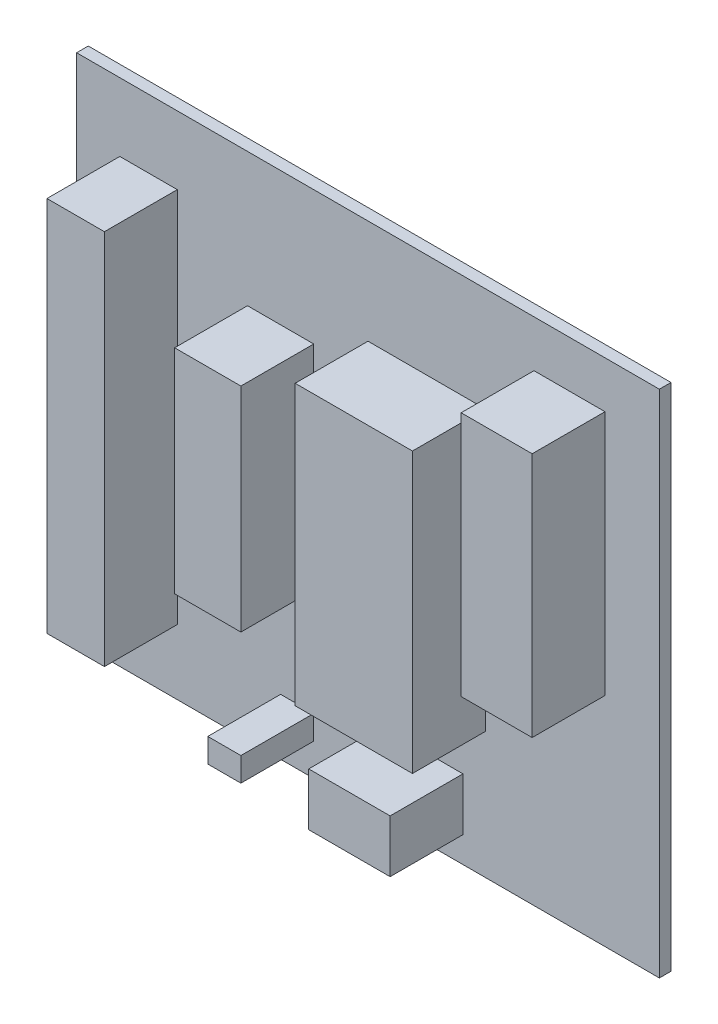
ISO-10303-21;
HEADER;
FILE_DESCRIPTION(('STEP AP214'),'2;1');
FILE_NAME('part.step','',(''),(''),'','','');
FILE_SCHEMA(('AUTOMOTIVE_DESIGN { 1 0 10303 214 1 1 1 1 }'));
ENDSEC;
DATA;
#1=APPLICATION_CONTEXT('core data for automotive mechanical design processes');
#2=APPLICATION_PROTOCOL_DEFINITION('international standard','automotive_design',2000,#1);
#3=PRODUCT_CONTEXT('',#1,'mechanical');
#4=PRODUCT('Part','Part','',(#3));
#5=PRODUCT_RELATED_PRODUCT_CATEGORY('part','',(#4));
#6=PRODUCT_DEFINITION_FORMATION('','',#4);
#7=PRODUCT_DEFINITION_CONTEXT('part definition',#1,'design');
#8=PRODUCT_DEFINITION('design','',#6,#7);
#9=PRODUCT_DEFINITION_SHAPE('','',#8);
#10=(LENGTH_UNIT() NAMED_UNIT(*) SI_UNIT(.MILLI.,.METRE.));
#11=(NAMED_UNIT(*) PLANE_ANGLE_UNIT() SI_UNIT($,.RADIAN.));
#12=(NAMED_UNIT(*) SI_UNIT($,.STERADIAN.) SOLID_ANGLE_UNIT());
#13=UNCERTAINTY_MEASURE_WITH_UNIT(LENGTH_MEASURE(1.E-05),#10,'distance_accuracy_value','');
#14=(GEOMETRIC_REPRESENTATION_CONTEXT(3) GLOBAL_UNCERTAINTY_ASSIGNED_CONTEXT((#13)) GLOBAL_UNIT_ASSIGNED_CONTEXT((#10,
#11,#12)) REPRESENTATION_CONTEXT('',''));
#15=CARTESIAN_POINT('',(0.,0.,0.));
#16=DIRECTION('',(0.,0.,1.));
#17=DIRECTION('',(1.,0.,0.));
#18=AXIS2_PLACEMENT_3D('',#15,#16,#17);
#19=CARTESIAN_POINT('',(0.,0.,0.8));
#20=DIRECTION('',(0.,0.,1.));
#21=DIRECTION('',(1.,0.,0.));
#22=AXIS2_PLACEMENT_3D('',#19,#20,#21);
#23=PLANE('',#22);
#24=DIRECTION('',(0.,-1.,0.));
#25=VECTOR('',#24,1.);
#26=CARTESIAN_POINT('',(-40.,35.,0.8));
#27=LINE('',#26,#25);
#28=CARTESIAN_POINT('',(-40.,35.,0.8));
#29=VERTEX_POINT('',#28);
#30=CARTESIAN_POINT('',(-40.,-35.,0.8));
#31=VERTEX_POINT('',#30);
#32=EDGE_CURVE('E392',#29,#31,#27,.T.);
#33=ORIENTED_EDGE('',*,*,#32,.T.);
#34=DIRECTION('',(1.,0.,0.));
#35=VECTOR('',#34,1.);
#36=CARTESIAN_POINT('',(-40.,-35.,0.8));
#37=LINE('',#36,#35);
#38=CARTESIAN_POINT('',(40.,-35.,0.8));
#39=VERTEX_POINT('',#38);
#40=EDGE_CURVE('E395',#31,#39,#37,.T.);
#41=ORIENTED_EDGE('',*,*,#40,.T.);
#42=DIRECTION('',(0.,1.,0.));
#43=VECTOR('',#42,1.);
#44=CARTESIAN_POINT('',(40.,35.,0.8));
#45=LINE('',#44,#43);
#46=CARTESIAN_POINT('',(40.,35.,0.8));
#47=VERTEX_POINT('',#46);
#48=EDGE_CURVE('E398',#39,#47,#45,.T.);
#49=ORIENTED_EDGE('',*,*,#48,.T.);
#50=DIRECTION('',(-1.,0.,0.));
#51=VECTOR('',#50,1.);
#52=CARTESIAN_POINT('',(-40.,35.,0.8));
#53=LINE('',#52,#51);
#54=EDGE_CURVE('E400',#47,#29,#53,.T.);
#55=ORIENTED_EDGE('',*,*,#54,.T.);
#56=EDGE_LOOP('',(#33,#41,#49,#55));
#57=FACE_BOUND('',#56,.T.);
#58=DIRECTION('',(1.,0.,0.));
#59=VECTOR('',#58,1.);
#60=CARTESIAN_POINT('',(-16.5417209365007,-12.5979993887254,0.8));
#61=LINE('',#60,#59);
#62=CARTESIAN_POINT('',(-16.5417209365007,-12.5979993887254,0.8));
#63=VERTEX_POINT('',#62);
#64=CARTESIAN_POINT('',(-7.44925181246366,-12.5979993887254,0.8));
#65=VERTEX_POINT('',#64);
#66=EDGE_CURVE('E376',#63,#65,#61,.T.);
#67=ORIENTED_EDGE('',*,*,#66,.F.);
#68=DIRECTION('',(0.,-1.,0.));
#69=VECTOR('',#68,1.);
#70=CARTESIAN_POINT('',(-16.5417209365007,-12.5979993887254,0.8));
#71=LINE('',#70,#69);
#72=CARTESIAN_POINT('',(-16.5417209365007,16.6512687572722,0.8));
#73=VERTEX_POINT('',#72);
#74=EDGE_CURVE('E362',#73,#63,#71,.T.);
#75=ORIENTED_EDGE('',*,*,#74,.F.);
#76=DIRECTION('',(-1.,0.,0.));
#77=VECTOR('',#76,1.);
#78=CARTESIAN_POINT('',(-16.5417209365007,16.6512687572722,0.8));
#79=LINE('',#78,#77);
#80=CARTESIAN_POINT('',(-7.44925181246366,16.6512687572722,0.8));
#81=VERTEX_POINT('',#80);
#82=EDGE_CURVE('E367',#81,#73,#79,.T.);
#83=ORIENTED_EDGE('',*,*,#82,.F.);
#84=DIRECTION('',(0.,1.,0.));
#85=VECTOR('',#84,1.);
#86=CARTESIAN_POINT('',(-7.44925181246366,-12.5979993887254,0.8));
#87=LINE('',#86,#85);
#88=EDGE_CURVE('E378',#65,#81,#87,.T.);
#89=ORIENTED_EDGE('',*,*,#88,.F.);
#90=EDGE_LOOP('',(#67,#75,#83,#89));
#91=FACE_BOUND('',#90,.T.);
#92=DIRECTION('',(1.,0.,0.));
#93=VECTOR('',#92,1.);
#94=CARTESIAN_POINT('',(0.,-17.6371991442158,0.8));
#95=LINE('',#94,#93);
#96=CARTESIAN_POINT('',(0.,-17.6371991442158,0.8));
#97=VERTEX_POINT('',#96);
#98=CARTESIAN_POINT('',(16.1035296534147,-17.6371991442158,0.8));
#99=VERTEX_POINT('',#98);
#100=EDGE_CURVE('E347',#97,#99,#95,.T.);
#101=ORIENTED_EDGE('',*,*,#100,.F.);
#102=DIRECTION('',(0.,-1.,0.));
#103=VECTOR('',#102,1.);
#104=CARTESIAN_POINT('',(0.,-17.6371991442158,0.8));
#105=LINE('',#104,#103);
#106=CARTESIAN_POINT('',(0.,20.7045381258184,0.8));
#107=VERTEX_POINT('',#106);
#108=EDGE_CURVE('E333',#107,#97,#105,.T.);
#109=ORIENTED_EDGE('',*,*,#108,.F.);
#110=DIRECTION('',(-1.,0.,0.));
#111=VECTOR('',#110,1.);
#112=CARTESIAN_POINT('',(0.,20.7045381258184,0.8));
#113=LINE('',#112,#111);
#114=CARTESIAN_POINT('',(16.1035296534147,20.7045381258184,0.8));
#115=VERTEX_POINT('',#114);
#116=EDGE_CURVE('E338',#115,#107,#113,.T.);
#117=ORIENTED_EDGE('',*,*,#116,.F.);
#118=DIRECTION('',(0.,1.,0.));
#119=VECTOR('',#118,1.);
#120=CARTESIAN_POINT('',(16.1035296534147,-17.6371991442158,0.8));
#121=LINE('',#120,#119);
#122=EDGE_CURVE('E349',#99,#115,#121,.T.);
#123=ORIENTED_EDGE('',*,*,#122,.F.);
#124=EDGE_LOOP('',(#101,#109,#117,#123));
#125=FACE_BOUND('',#124,.T.);
#126=DIRECTION('',(1.,0.,0.));
#127=VECTOR('',#126,1.);
#128=CARTESIAN_POINT('',(-34.0693722599452,-26.0723813436231,0.8));
#129=LINE('',#128,#127);
#130=CARTESIAN_POINT('',(-34.0693722599452,-26.0723813436231,0.8));
#131=VERTEX_POINT('',#130);
#132=CARTESIAN_POINT('',(-26.1819291643947,-26.0723813436231,0.8));
#133=VERTEX_POINT('',#132);
#134=EDGE_CURVE('E318',#131,#133,#129,.T.);
#135=ORIENTED_EDGE('',*,*,#134,.F.);
#136=DIRECTION('',(0.,-1.,0.));
#137=VECTOR('',#136,1.);
#138=CARTESIAN_POINT('',(-34.0693722599452,-26.0723813436231,0.8));
#139=LINE('',#138,#137);
#140=CARTESIAN_POINT('',(-34.0693722599452,25.6341900605376,0.8));
#141=VERTEX_POINT('',#140);
#142=EDGE_CURVE('E304',#141,#131,#139,.T.);
#143=ORIENTED_EDGE('',*,*,#142,.F.);
#144=DIRECTION('',(-1.,0.,0.));
#145=VECTOR('',#144,1.);
#146=CARTESIAN_POINT('',(-34.0693722599452,25.6341900605376,0.8));
#147=LINE('',#146,#145);
#148=CARTESIAN_POINT('',(-26.1819291643947,25.6341900605376,0.8));
#149=VERTEX_POINT('',#148);
#150=EDGE_CURVE('E309',#149,#141,#147,.T.);
#151=ORIENTED_EDGE('',*,*,#150,.F.);
#152=DIRECTION('',(0.,1.,0.));
#153=VECTOR('',#152,1.);
#154=CARTESIAN_POINT('',(-26.1819291643947,-26.0723813436231,0.8));
#155=LINE('',#154,#153);
#156=EDGE_CURVE('E320',#133,#149,#155,.T.);
#157=ORIENTED_EDGE('',*,*,#156,.F.);
#158=EDGE_LOOP('',(#135,#143,#151,#157));
#159=FACE_BOUND('',#158,.T.);
#160=DIRECTION('',(1.,0.,0.));
#161=VECTOR('',#160,1.);
#162=CARTESIAN_POINT('',(22.7859467204776,-5.14874757626201,0.8));
#163=LINE('',#162,#161);
#164=CARTESIAN_POINT('',(22.7859467204776,-5.14874757626201,0.8));
#165=VERTEX_POINT('',#164);
#166=CARTESIAN_POINT('',(32.5357027691438,-5.14874757626201,0.8));
#167=VERTEX_POINT('',#166);
#168=EDGE_CURVE('E289',#165,#167,#163,.T.);
#169=ORIENTED_EDGE('',*,*,#168,.F.);
#170=DIRECTION('',(0.,-1.,0.));
#171=VECTOR('',#170,1.);
#172=CARTESIAN_POINT('',(22.7859467204776,-5.14874757626201,0.8));
#173=LINE('',#172,#171);
#174=CARTESIAN_POINT('',(22.7859467204776,28.5919812213682,0.8));
#175=VERTEX_POINT('',#174);
#176=EDGE_CURVE('E275',#175,#165,#173,.T.);
#177=ORIENTED_EDGE('',*,*,#176,.F.);
#178=DIRECTION('',(-1.,0.,0.));
#179=VECTOR('',#178,1.);
#180=CARTESIAN_POINT('',(22.7859467204776,28.5919812213682,0.8));
#181=LINE('',#180,#179);
#182=CARTESIAN_POINT('',(32.5357027691438,28.5919812213682,0.8));
#183=VERTEX_POINT('',#182);
#184=EDGE_CURVE('E280',#183,#175,#181,.T.);
#185=ORIENTED_EDGE('',*,*,#184,.F.);
#186=DIRECTION('',(0.,1.,0.));
#187=VECTOR('',#186,1.);
#188=CARTESIAN_POINT('',(32.5357027691438,-5.14874757626201,0.8));
#189=LINE('',#188,#187);
#190=EDGE_CURVE('E291',#167,#183,#189,.T.);
#191=ORIENTED_EDGE('',*,*,#190,.F.);
#192=EDGE_LOOP('',(#169,#177,#185,#191));
#193=FACE_BOUND('',#192,.T.);
#194=DIRECTION('',(1.,0.,0.));
#195=VECTOR('',#194,1.);
#196=CARTESIAN_POINT('',(-11.9954863744822,-30.5638419952559,0.8));
#197=LINE('',#196,#195);
#198=CARTESIAN_POINT('',(-11.9954863744822,-30.5638419952559,0.8));
#199=VERTEX_POINT('',#198);
#200=CARTESIAN_POINT('',(-7.44925181246366,-30.5638419952559,0.8));
#201=VERTEX_POINT('',#200);
#202=EDGE_CURVE('E247',#199,#201,#197,.T.);
#203=ORIENTED_EDGE('',*,*,#202,.F.);
#204=DIRECTION('',(0.,-1.,0.));
#205=VECTOR('',#204,1.);
#206=CARTESIAN_POINT('',(-11.9954863744822,-30.5638419952559,0.8));
#207=LINE('',#206,#205);
#208=CARTESIAN_POINT('',(-11.9954863744822,-27.2774073721101,0.8));
#209=VERTEX_POINT('',#208);
#210=EDGE_CURVE('E244',#209,#199,#207,.T.);
#211=ORIENTED_EDGE('',*,*,#210,.F.);
#212=DIRECTION('',(-1.,0.,0.));
#213=VECTOR('',#212,1.);
#214=CARTESIAN_POINT('',(-11.9954863744822,-27.2774073721101,0.8));
#215=LINE('',#214,#213);
#216=CARTESIAN_POINT('',(-7.44925181246366,-27.2774073721101,0.8));
#217=VERTEX_POINT('',#216);
#218=EDGE_CURVE('E256',#217,#209,#215,.T.);
#219=ORIENTED_EDGE('',*,*,#218,.F.);
#220=DIRECTION('',(0.,1.,0.));
#221=VECTOR('',#220,1.);
#222=CARTESIAN_POINT('',(-7.44925181246366,-30.5638419952559,0.8));
#223=LINE('',#222,#221);
#224=EDGE_CURVE('E264',#201,#217,#223,.T.);
#225=ORIENTED_EDGE('',*,*,#224,.F.);
#226=EDGE_LOOP('',(#203,#211,#219,#225));
#227=FACE_BOUND('',#226,.T.);
#228=DIRECTION('',(1.,0.,0.));
#229=VECTOR('',#228,1.);
#230=CARTESIAN_POINT('',(1.86231295311562,-31.4402245614283,0.8));
#231=LINE('',#230,#229);
#232=CARTESIAN_POINT('',(1.86231295311562,-31.4402245614283,0.8));
#233=VERTEX_POINT('',#232);
#234=CARTESIAN_POINT('',(13.0361906718114,-31.4402245614283,0.8));
#235=VERTEX_POINT('',#234);
#236=EDGE_CURVE('E781',#233,#235,#231,.T.);
#237=ORIENTED_EDGE('',*,*,#236,.F.);
#238=DIRECTION('',(0.,-1.,0.));
#239=VECTOR('',#238,1.);
#240=CARTESIAN_POINT('',(1.86231295311562,-31.4402245614283,0.8));
#241=LINE('',#240,#239);
#242=CARTESIAN_POINT('',(1.86231295311562,-24.2100683905076,0.8));
#243=VERTEX_POINT('',#242);
#244=EDGE_CURVE('E242',#243,#233,#241,.T.);
#245=ORIENTED_EDGE('',*,*,#244,.F.);
#246=DIRECTION('',(-1.,0.,0.));
#247=VECTOR('',#246,1.);
#248=CARTESIAN_POINT('',(1.86231295311562,-24.2100683905076,0.8));
#249=LINE('',#248,#247);
#250=CARTESIAN_POINT('',(13.0361906718114,-24.2100683905076,0.8));
#251=VERTEX_POINT('',#250);
#252=EDGE_CURVE('E238',#251,#243,#249,.T.);
#253=ORIENTED_EDGE('',*,*,#252,.F.);
#254=DIRECTION('',(0.,1.,0.));
#255=VECTOR('',#254,1.);
#256=CARTESIAN_POINT('',(13.0361906718114,-31.4402245614283,0.8));
#257=LINE('',#256,#255);
#258=EDGE_CURVE('E778',#235,#251,#257,.T.);
#259=ORIENTED_EDGE('',*,*,#258,.F.);
#260=EDGE_LOOP('',(#237,#245,#253,#259));
#261=FACE_BOUND('',#260,.T.);
#262=ADVANCED_FACE('F33',(#57,#91,#125,#159,#193,#227,#261),#23,.T.);
#263=CARTESIAN_POINT('',(-40.,35.,0.8));
#264=DIRECTION('',(1.,0.,0.));
#265=DIRECTION('',(0.,1.,0.));
#266=AXIS2_PLACEMENT_3D('',#263,#264,#265);
#267=PLANE('',#266);
#268=DIRECTION('',(0.,-1.,0.));
#269=VECTOR('',#268,1.);
#270=CARTESIAN_POINT('',(-40.,35.,-0.8));
#271=LINE('',#270,#269);
#272=CARTESIAN_POINT('',(-40.,35.,-0.8));
#273=VERTEX_POINT('',#272);
#274=CARTESIAN_POINT('',(-40.,-35.,-0.8));
#275=VERTEX_POINT('',#274);
#276=EDGE_CURVE('E391',#273,#275,#271,.T.);
#277=ORIENTED_EDGE('',*,*,#276,.T.);
#278=DIRECTION('',(0.,0.,-1.));
#279=VECTOR('',#278,1.);
#280=CARTESIAN_POINT('',(-40.,-35.,0.8));
#281=LINE('',#280,#279);
#282=EDGE_CURVE('E11',#31,#275,#281,.T.);
#283=ORIENTED_EDGE('',*,*,#282,.F.);
#284=ORIENTED_EDGE('',*,*,#32,.F.);
#285=DIRECTION('',(0.,0.,-1.));
#286=VECTOR('',#285,1.);
#287=CARTESIAN_POINT('',(-40.,35.,0.8));
#288=LINE('',#287,#286);
#289=EDGE_CURVE('E402',#29,#273,#288,.T.);
#290=ORIENTED_EDGE('',*,*,#289,.T.);
#291=EDGE_LOOP('',(#277,#283,#284,#290));
#292=FACE_BOUND('',#291,.T.);
#293=ADVANCED_FACE('F35',(#292),#267,.F.);
#294=CARTESIAN_POINT('',(-40.,-35.,0.8));
#295=DIRECTION('',(0.,1.,0.));
#296=DIRECTION('',(0.,0.,1.));
#297=AXIS2_PLACEMENT_3D('',#294,#295,#296);
#298=PLANE('',#297);
#299=DIRECTION('',(1.,0.,0.));
#300=VECTOR('',#299,1.);
#301=CARTESIAN_POINT('',(-40.,-35.,-0.8));
#302=LINE('',#301,#300);
#303=CARTESIAN_POINT('',(40.,-35.,-0.8));
#304=VERTEX_POINT('',#303);
#305=EDGE_CURVE('E405',#275,#304,#302,.T.);
#306=ORIENTED_EDGE('',*,*,#305,.T.);
#307=DIRECTION('',(0.,0.,-1.));
#308=VECTOR('',#307,1.);
#309=CARTESIAN_POINT('',(40.,-35.,0.8));
#310=LINE('',#309,#308);
#311=EDGE_CURVE('E41',#39,#304,#310,.T.);
#312=ORIENTED_EDGE('',*,*,#311,.F.);
#313=ORIENTED_EDGE('',*,*,#40,.F.);
#314=ORIENTED_EDGE('',*,*,#282,.T.);
#315=EDGE_LOOP('',(#306,#312,#313,#314));
#316=FACE_BOUND('',#315,.T.);
#317=ADVANCED_FACE('F435',(#316),#298,.F.);
#318=CARTESIAN_POINT('',(40.,35.,0.8));
#319=DIRECTION('',(-1.,0.,0.));
#320=DIRECTION('',(0.,-1.,0.));
#321=AXIS2_PLACEMENT_3D('',#318,#319,#320);
#322=PLANE('',#321);
#323=DIRECTION('',(0.,1.,0.));
#324=VECTOR('',#323,1.);
#325=CARTESIAN_POINT('',(40.,35.,-0.8));
#326=LINE('',#325,#324);
#327=CARTESIAN_POINT('',(40.,35.,-0.8));
#328=VERTEX_POINT('',#327);
#329=EDGE_CURVE('E407',#304,#328,#326,.T.);
#330=ORIENTED_EDGE('',*,*,#329,.T.);
#331=DIRECTION('',(0.,0.,-1.));
#332=VECTOR('',#331,1.);
#333=CARTESIAN_POINT('',(40.,35.,0.8));
#334=LINE('',#333,#332);
#335=EDGE_CURVE('E412',#47,#328,#334,.T.);
#336=ORIENTED_EDGE('',*,*,#335,.F.);
#337=ORIENTED_EDGE('',*,*,#48,.F.);
#338=ORIENTED_EDGE('',*,*,#311,.T.);
#339=EDGE_LOOP('',(#330,#336,#337,#338));
#340=FACE_BOUND('',#339,.T.);
#341=ADVANCED_FACE('F419',(#340),#322,.F.);
#342=CARTESIAN_POINT('',(-40.,35.,0.8));
#343=DIRECTION('',(0.,-1.,0.));
#344=DIRECTION('',(0.,0.,-1.));
#345=AXIS2_PLACEMENT_3D('',#342,#343,#344);
#346=PLANE('',#345);
#347=DIRECTION('',(-1.,0.,0.));
#348=VECTOR('',#347,1.);
#349=CARTESIAN_POINT('',(-40.,35.,-0.8));
#350=LINE('',#349,#348);
#351=EDGE_CURVE('E396',#328,#273,#350,.T.);
#352=ORIENTED_EDGE('',*,*,#351,.T.);
#353=ORIENTED_EDGE('',*,*,#289,.F.);
#354=ORIENTED_EDGE('',*,*,#54,.F.);
#355=ORIENTED_EDGE('',*,*,#335,.T.);
#356=EDGE_LOOP('',(#352,#353,#354,#355));
#357=FACE_BOUND('',#356,.T.);
#358=ADVANCED_FACE('F428',(#357),#346,.F.);
#359=CARTESIAN_POINT('',(0.,0.,-0.8));
#360=DIRECTION('',(0.,0.,1.));
#361=DIRECTION('',(1.,0.,0.));
#362=AXIS2_PLACEMENT_3D('',#359,#360,#361);
#363=PLANE('',#362);
#364=ORIENTED_EDGE('',*,*,#276,.F.);
#365=ORIENTED_EDGE('',*,*,#351,.F.);
#366=ORIENTED_EDGE('',*,*,#329,.F.);
#367=ORIENTED_EDGE('',*,*,#305,.F.);
#368=EDGE_LOOP('',(#364,#365,#366,#367));
#369=FACE_BOUND('',#368,.T.);
#370=ADVANCED_FACE('F425',(#369),#363,.F.);
#371=CARTESIAN_POINT('',(-16.5417209365007,-12.5979993887254,10.8));
#372=DIRECTION('',(1.,0.,0.));
#373=DIRECTION('',(0.,0.,-1.));
#374=AXIS2_PLACEMENT_3D('',#371,#372,#373);
#375=PLANE('',#374);
#376=ORIENTED_EDGE('',*,*,#74,.T.);
#377=DIRECTION('',(0.,0.,-1.));
#378=VECTOR('',#377,1.);
#379=CARTESIAN_POINT('',(-16.5417209365007,-12.5979993887254,10.8));
#380=LINE('',#379,#378);
#381=CARTESIAN_POINT('',(-16.5417209365007,-12.5979993887254,10.8));
#382=VERTEX_POINT('',#381);
#383=EDGE_CURVE('E389',#382,#63,#380,.T.);
#384=ORIENTED_EDGE('',*,*,#383,.F.);
#385=DIRECTION('',(0.,-1.,0.));
#386=VECTOR('',#385,1.);
#387=CARTESIAN_POINT('',(-16.5417209365007,-12.5979993887254,10.8));
#388=LINE('',#387,#386);
#389=CARTESIAN_POINT('',(-16.5417209365007,16.6512687572722,10.8));
#390=VERTEX_POINT('',#389);
#391=EDGE_CURVE('E363',#390,#382,#388,.T.);
#392=ORIENTED_EDGE('',*,*,#391,.F.);
#393=DIRECTION('',(0.,0.,-1.));
#394=VECTOR('',#393,1.);
#395=CARTESIAN_POINT('',(-16.5417209365007,16.6512687572722,10.8));
#396=LINE('',#395,#394);
#397=EDGE_CURVE('E373',#390,#73,#396,.T.);
#398=ORIENTED_EDGE('',*,*,#397,.T.);
#399=EDGE_LOOP('',(#376,#384,#392,#398));
#400=FACE_BOUND('',#399,.T.);
#401=ADVANCED_FACE('F448',(#400),#375,.F.);
#402=CARTESIAN_POINT('',(-16.5417209365007,-12.5979993887254,10.8));
#403=DIRECTION('',(0.,1.,0.));
#404=DIRECTION('',(0.,0.,1.));
#405=AXIS2_PLACEMENT_3D('',#402,#403,#404);
#406=PLANE('',#405);
#407=ORIENTED_EDGE('',*,*,#66,.T.);
#408=DIRECTION('',(0.,0.,-1.));
#409=VECTOR('',#408,1.);
#410=CARTESIAN_POINT('',(-7.44925181246366,-12.5979993887254,10.8));
#411=LINE('',#410,#409);
#412=CARTESIAN_POINT('',(-7.44925181246366,-12.5979993887254,10.8));
#413=VERTEX_POINT('',#412);
#414=EDGE_CURVE('E386',#413,#65,#411,.T.);
#415=ORIENTED_EDGE('',*,*,#414,.F.);
#416=DIRECTION('',(1.,0.,0.));
#417=VECTOR('',#416,1.);
#418=CARTESIAN_POINT('',(-16.5417209365007,-12.5979993887254,10.8));
#419=LINE('',#418,#417);
#420=EDGE_CURVE('E366',#382,#413,#419,.T.);
#421=ORIENTED_EDGE('',*,*,#420,.F.);
#422=ORIENTED_EDGE('',*,*,#383,.T.);
#423=EDGE_LOOP('',(#407,#415,#421,#422));
#424=FACE_BOUND('',#423,.T.);
#425=ADVANCED_FACE('F467',(#424),#406,.F.);
#426=CARTESIAN_POINT('',(-7.44925181246366,-12.5979993887254,10.8));
#427=DIRECTION('',(-1.,0.,0.));
#428=DIRECTION('',(0.,0.,1.));
#429=AXIS2_PLACEMENT_3D('',#426,#427,#428);
#430=PLANE('',#429);
#431=ORIENTED_EDGE('',*,*,#88,.T.);
#432=DIRECTION('',(0.,0.,-1.));
#433=VECTOR('',#432,1.);
#434=CARTESIAN_POINT('',(-7.44925181246366,16.6512687572722,10.8));
#435=LINE('',#434,#433);
#436=CARTESIAN_POINT('',(-7.44925181246366,16.6512687572722,10.8));
#437=VERTEX_POINT('',#436);
#438=EDGE_CURVE('E384',#437,#81,#435,.T.);
#439=ORIENTED_EDGE('',*,*,#438,.F.);
#440=DIRECTION('',(0.,1.,0.));
#441=VECTOR('',#440,1.);
#442=CARTESIAN_POINT('',(-7.44925181246366,-12.5979993887254,10.8));
#443=LINE('',#442,#441);
#444=EDGE_CURVE('E369',#413,#437,#443,.T.);
#445=ORIENTED_EDGE('',*,*,#444,.F.);
#446=ORIENTED_EDGE('',*,*,#414,.T.);
#447=EDGE_LOOP('',(#431,#439,#445,#446));
#448=FACE_BOUND('',#447,.T.);
#449=ADVANCED_FACE('F474',(#448),#430,.F.);
#450=CARTESIAN_POINT('',(-16.5417209365007,16.6512687572722,10.8));
#451=DIRECTION('',(0.,-1.,0.));
#452=DIRECTION('',(0.,0.,-1.));
#453=AXIS2_PLACEMENT_3D('',#450,#451,#452);
#454=PLANE('',#453);
#455=ORIENTED_EDGE('',*,*,#82,.T.);
#456=ORIENTED_EDGE('',*,*,#397,.F.);
#457=DIRECTION('',(-1.,0.,0.));
#458=VECTOR('',#457,1.);
#459=CARTESIAN_POINT('',(-16.5417209365007,16.6512687572722,10.8));
#460=LINE('',#459,#458);
#461=EDGE_CURVE('E371',#437,#390,#460,.T.);
#462=ORIENTED_EDGE('',*,*,#461,.F.);
#463=ORIENTED_EDGE('',*,*,#438,.T.);
#464=EDGE_LOOP('',(#455,#456,#462,#463));
#465=FACE_BOUND('',#464,.T.);
#466=ADVANCED_FACE('F481',(#465),#454,.F.);
#467=CARTESIAN_POINT('',(0.,0.,10.8));
#468=DIRECTION('',(0.,0.,-1.));
#469=DIRECTION('',(-1.,0.,0.));
#470=AXIS2_PLACEMENT_3D('',#467,#468,#469);
#471=PLANE('',#470);
#472=ORIENTED_EDGE('',*,*,#391,.T.);
#473=ORIENTED_EDGE('',*,*,#420,.T.);
#474=ORIENTED_EDGE('',*,*,#444,.T.);
#475=ORIENTED_EDGE('',*,*,#461,.T.);
#476=EDGE_LOOP('',(#472,#473,#474,#475));
#477=FACE_BOUND('',#476,.T.);
#478=ADVANCED_FACE('F489',(#477),#471,.F.);
#479=CARTESIAN_POINT('',(0.,-17.6371991442158,10.8));
#480=DIRECTION('',(1.,0.,0.));
#481=DIRECTION('',(0.,0.,-1.));
#482=AXIS2_PLACEMENT_3D('',#479,#480,#481);
#483=PLANE('',#482);
#484=ORIENTED_EDGE('',*,*,#108,.T.);
#485=DIRECTION('',(0.,0.,-1.));
#486=VECTOR('',#485,1.);
#487=CARTESIAN_POINT('',(0.,-17.6371991442158,10.8));
#488=LINE('',#487,#486);
#489=CARTESIAN_POINT('',(0.,-17.6371991442158,10.8));
#490=VERTEX_POINT('',#489);
#491=EDGE_CURVE('E360',#490,#97,#488,.T.);
#492=ORIENTED_EDGE('',*,*,#491,.F.);
#493=DIRECTION('',(0.,-1.,0.));
#494=VECTOR('',#493,1.);
#495=CARTESIAN_POINT('',(0.,-17.6371991442158,10.8));
#496=LINE('',#495,#494);
#497=CARTESIAN_POINT('',(0.,20.7045381258184,10.8));
#498=VERTEX_POINT('',#497);
#499=EDGE_CURVE('E334',#498,#490,#496,.T.);
#500=ORIENTED_EDGE('',*,*,#499,.F.);
#501=DIRECTION('',(0.,0.,-1.));
#502=VECTOR('',#501,1.);
#503=CARTESIAN_POINT('',(0.,20.7045381258184,10.8));
#504=LINE('',#503,#502);
#505=EDGE_CURVE('E344',#498,#107,#504,.T.);
#506=ORIENTED_EDGE('',*,*,#505,.T.);
#507=EDGE_LOOP('',(#484,#492,#500,#506));
#508=FACE_BOUND('',#507,.T.);
#509=ADVANCED_FACE('F497',(#508),#483,.F.);
#510=CARTESIAN_POINT('',(0.,-17.6371991442158,10.8));
#511=DIRECTION('',(0.,1.,0.));
#512=DIRECTION('',(0.,0.,1.));
#513=AXIS2_PLACEMENT_3D('',#510,#511,#512);
#514=PLANE('',#513);
#515=ORIENTED_EDGE('',*,*,#100,.T.);
#516=DIRECTION('',(0.,0.,-1.));
#517=VECTOR('',#516,1.);
#518=CARTESIAN_POINT('',(16.1035296534147,-17.6371991442158,10.8));
#519=LINE('',#518,#517);
#520=CARTESIAN_POINT('',(16.1035296534147,-17.6371991442158,10.8));
#521=VERTEX_POINT('',#520);
#522=EDGE_CURVE('E357',#521,#99,#519,.T.);
#523=ORIENTED_EDGE('',*,*,#522,.F.);
#524=DIRECTION('',(1.,0.,0.));
#525=VECTOR('',#524,1.);
#526=CARTESIAN_POINT('',(0.,-17.6371991442158,10.8));
#527=LINE('',#526,#525);
#528=EDGE_CURVE('E337',#490,#521,#527,.T.);
#529=ORIENTED_EDGE('',*,*,#528,.F.);
#530=ORIENTED_EDGE('',*,*,#491,.T.);
#531=EDGE_LOOP('',(#515,#523,#529,#530));
#532=FACE_BOUND('',#531,.T.);
#533=ADVANCED_FACE('F505',(#532),#514,.F.);
#534=CARTESIAN_POINT('',(16.1035296534147,-17.6371991442158,10.8));
#535=DIRECTION('',(-1.,0.,0.));
#536=DIRECTION('',(0.,0.,1.));
#537=AXIS2_PLACEMENT_3D('',#534,#535,#536);
#538=PLANE('',#537);
#539=ORIENTED_EDGE('',*,*,#122,.T.);
#540=DIRECTION('',(0.,0.,-1.));
#541=VECTOR('',#540,1.);
#542=CARTESIAN_POINT('',(16.1035296534147,20.7045381258184,10.8));
#543=LINE('',#542,#541);
#544=CARTESIAN_POINT('',(16.1035296534147,20.7045381258184,10.8));
#545=VERTEX_POINT('',#544);
#546=EDGE_CURVE('E355',#545,#115,#543,.T.);
#547=ORIENTED_EDGE('',*,*,#546,.F.);
#548=DIRECTION('',(0.,1.,0.));
#549=VECTOR('',#548,1.);
#550=CARTESIAN_POINT('',(16.1035296534147,-17.6371991442158,10.8));
#551=LINE('',#550,#549);
#552=EDGE_CURVE('E340',#521,#545,#551,.T.);
#553=ORIENTED_EDGE('',*,*,#552,.F.);
#554=ORIENTED_EDGE('',*,*,#522,.T.);
#555=EDGE_LOOP('',(#539,#547,#553,#554));
#556=FACE_BOUND('',#555,.T.);
#557=ADVANCED_FACE('F513',(#556),#538,.F.);
#558=CARTESIAN_POINT('',(0.,20.7045381258184,10.8));
#559=DIRECTION('',(0.,-1.,0.));
#560=DIRECTION('',(0.,0.,-1.));
#561=AXIS2_PLACEMENT_3D('',#558,#559,#560);
#562=PLANE('',#561);
#563=ORIENTED_EDGE('',*,*,#116,.T.);
#564=ORIENTED_EDGE('',*,*,#505,.F.);
#565=DIRECTION('',(-1.,0.,0.));
#566=VECTOR('',#565,1.);
#567=CARTESIAN_POINT('',(0.,20.7045381258184,10.8));
#568=LINE('',#567,#566);
#569=EDGE_CURVE('E342',#545,#498,#568,.T.);
#570=ORIENTED_EDGE('',*,*,#569,.F.);
#571=ORIENTED_EDGE('',*,*,#546,.T.);
#572=EDGE_LOOP('',(#563,#564,#570,#571));
#573=FACE_BOUND('',#572,.T.);
#574=ADVANCED_FACE('F521',(#573),#562,.F.);
#575=CARTESIAN_POINT('',(0.,0.,10.8));
#576=DIRECTION('',(0.,0.,-1.));
#577=DIRECTION('',(-1.,0.,0.));
#578=AXIS2_PLACEMENT_3D('',#575,#576,#577);
#579=PLANE('',#578);
#580=ORIENTED_EDGE('',*,*,#499,.T.);
#581=ORIENTED_EDGE('',*,*,#528,.T.);
#582=ORIENTED_EDGE('',*,*,#552,.T.);
#583=ORIENTED_EDGE('',*,*,#569,.T.);
#584=EDGE_LOOP('',(#580,#581,#582,#583));
#585=FACE_BOUND('',#584,.T.);
#586=ADVANCED_FACE('F529',(#585),#579,.F.);
#587=CARTESIAN_POINT('',(-34.0693722599452,-26.0723813436231,10.8));
#588=DIRECTION('',(1.,0.,0.));
#589=DIRECTION('',(0.,0.,-1.));
#590=AXIS2_PLACEMENT_3D('',#587,#588,#589);
#591=PLANE('',#590);
#592=ORIENTED_EDGE('',*,*,#142,.T.);
#593=DIRECTION('',(0.,0.,-1.));
#594=VECTOR('',#593,1.);
#595=CARTESIAN_POINT('',(-34.0693722599452,-26.0723813436231,10.8));
#596=LINE('',#595,#594);
#597=CARTESIAN_POINT('',(-34.0693722599452,-26.0723813436231,10.8));
#598=VERTEX_POINT('',#597);
#599=EDGE_CURVE('E331',#598,#131,#596,.T.);
#600=ORIENTED_EDGE('',*,*,#599,.F.);
#601=DIRECTION('',(0.,-1.,0.));
#602=VECTOR('',#601,1.);
#603=CARTESIAN_POINT('',(-34.0693722599452,-26.0723813436231,10.8));
#604=LINE('',#603,#602);
#605=CARTESIAN_POINT('',(-34.0693722599452,25.6341900605376,10.8));
#606=VERTEX_POINT('',#605);
#607=EDGE_CURVE('E305',#606,#598,#604,.T.);
#608=ORIENTED_EDGE('',*,*,#607,.F.);
#609=DIRECTION('',(0.,0.,-1.));
#610=VECTOR('',#609,1.);
#611=CARTESIAN_POINT('',(-34.0693722599452,25.6341900605376,10.8));
#612=LINE('',#611,#610);
#613=EDGE_CURVE('E315',#606,#141,#612,.T.);
#614=ORIENTED_EDGE('',*,*,#613,.T.);
#615=EDGE_LOOP('',(#592,#600,#608,#614));
#616=FACE_BOUND('',#615,.T.);
#617=ADVANCED_FACE('F537',(#616),#591,.F.);
#618=CARTESIAN_POINT('',(-34.0693722599452,-26.0723813436231,10.8));
#619=DIRECTION('',(0.,1.,0.));
#620=DIRECTION('',(0.,0.,1.));
#621=AXIS2_PLACEMENT_3D('',#618,#619,#620);
#622=PLANE('',#621);
#623=ORIENTED_EDGE('',*,*,#134,.T.);
#624=DIRECTION('',(0.,0.,-1.));
#625=VECTOR('',#624,1.);
#626=CARTESIAN_POINT('',(-26.1819291643947,-26.0723813436231,10.8));
#627=LINE('',#626,#625);
#628=CARTESIAN_POINT('',(-26.1819291643947,-26.0723813436231,10.8));
#629=VERTEX_POINT('',#628);
#630=EDGE_CURVE('E328',#629,#133,#627,.T.);
#631=ORIENTED_EDGE('',*,*,#630,.F.);
#632=DIRECTION('',(1.,0.,0.));
#633=VECTOR('',#632,1.);
#634=CARTESIAN_POINT('',(-34.0693722599452,-26.0723813436231,10.8));
#635=LINE('',#634,#633);
#636=EDGE_CURVE('E308',#598,#629,#635,.T.);
#637=ORIENTED_EDGE('',*,*,#636,.F.);
#638=ORIENTED_EDGE('',*,*,#599,.T.);
#639=EDGE_LOOP('',(#623,#631,#637,#638));
#640=FACE_BOUND('',#639,.T.);
#641=ADVANCED_FACE('F545',(#640),#622,.F.);
#642=CARTESIAN_POINT('',(-26.1819291643947,-26.0723813436231,10.8));
#643=DIRECTION('',(-1.,0.,0.));
#644=DIRECTION('',(0.,0.,1.));
#645=AXIS2_PLACEMENT_3D('',#642,#643,#644);
#646=PLANE('',#645);
#647=ORIENTED_EDGE('',*,*,#156,.T.);
#648=DIRECTION('',(0.,0.,-1.));
#649=VECTOR('',#648,1.);
#650=CARTESIAN_POINT('',(-26.1819291643947,25.6341900605376,10.8));
#651=LINE('',#650,#649);
#652=CARTESIAN_POINT('',(-26.1819291643947,25.6341900605376,10.8));
#653=VERTEX_POINT('',#652);
#654=EDGE_CURVE('E326',#653,#149,#651,.T.);
#655=ORIENTED_EDGE('',*,*,#654,.F.);
#656=DIRECTION('',(0.,1.,0.));
#657=VECTOR('',#656,1.);
#658=CARTESIAN_POINT('',(-26.1819291643947,-26.0723813436231,10.8));
#659=LINE('',#658,#657);
#660=EDGE_CURVE('E311',#629,#653,#659,.T.);
#661=ORIENTED_EDGE('',*,*,#660,.F.);
#662=ORIENTED_EDGE('',*,*,#630,.T.);
#663=EDGE_LOOP('',(#647,#655,#661,#662));
#664=FACE_BOUND('',#663,.T.);
#665=ADVANCED_FACE('F553',(#664),#646,.F.);
#666=CARTESIAN_POINT('',(-34.0693722599452,25.6341900605376,10.8));
#667=DIRECTION('',(0.,-1.,0.));
#668=DIRECTION('',(0.,0.,-1.));
#669=AXIS2_PLACEMENT_3D('',#666,#667,#668);
#670=PLANE('',#669);
#671=ORIENTED_EDGE('',*,*,#150,.T.);
#672=ORIENTED_EDGE('',*,*,#613,.F.);
#673=DIRECTION('',(-1.,0.,0.));
#674=VECTOR('',#673,1.);
#675=CARTESIAN_POINT('',(-34.0693722599452,25.6341900605376,10.8));
#676=LINE('',#675,#674);
#677=EDGE_CURVE('E313',#653,#606,#676,.T.);
#678=ORIENTED_EDGE('',*,*,#677,.F.);
#679=ORIENTED_EDGE('',*,*,#654,.T.);
#680=EDGE_LOOP('',(#671,#672,#678,#679));
#681=FACE_BOUND('',#680,.T.);
#682=ADVANCED_FACE('F561',(#681),#670,.F.);
#683=CARTESIAN_POINT('',(0.,0.,10.8));
#684=DIRECTION('',(0.,0.,-1.));
#685=DIRECTION('',(-1.,0.,0.));
#686=AXIS2_PLACEMENT_3D('',#683,#684,#685);
#687=PLANE('',#686);
#688=ORIENTED_EDGE('',*,*,#607,.T.);
#689=ORIENTED_EDGE('',*,*,#636,.T.);
#690=ORIENTED_EDGE('',*,*,#660,.T.);
#691=ORIENTED_EDGE('',*,*,#677,.T.);
#692=EDGE_LOOP('',(#688,#689,#690,#691));
#693=FACE_BOUND('',#692,.T.);
#694=ADVANCED_FACE('F569',(#693),#687,.F.);
#695=CARTESIAN_POINT('',(22.7859467204776,-5.14874757626201,10.8));
#696=DIRECTION('',(1.,0.,0.));
#697=DIRECTION('',(0.,0.,-1.));
#698=AXIS2_PLACEMENT_3D('',#695,#696,#697);
#699=PLANE('',#698);
#700=ORIENTED_EDGE('',*,*,#176,.T.);
#701=DIRECTION('',(0.,0.,-1.));
#702=VECTOR('',#701,1.);
#703=CARTESIAN_POINT('',(22.7859467204776,-5.14874757626201,10.8));
#704=LINE('',#703,#702);
#705=CARTESIAN_POINT('',(22.7859467204776,-5.14874757626201,10.8));
#706=VERTEX_POINT('',#705);
#707=EDGE_CURVE('E302',#706,#165,#704,.T.);
#708=ORIENTED_EDGE('',*,*,#707,.F.);
#709=DIRECTION('',(0.,-1.,0.));
#710=VECTOR('',#709,1.);
#711=CARTESIAN_POINT('',(22.7859467204776,-5.14874757626201,10.8));
#712=LINE('',#711,#710);
#713=CARTESIAN_POINT('',(22.7859467204776,28.5919812213682,10.8));
#714=VERTEX_POINT('',#713);
#715=EDGE_CURVE('E276',#714,#706,#712,.T.);
#716=ORIENTED_EDGE('',*,*,#715,.F.);
#717=DIRECTION('',(0.,0.,-1.));
#718=VECTOR('',#717,1.);
#719=CARTESIAN_POINT('',(22.7859467204776,28.5919812213682,10.8));
#720=LINE('',#719,#718);
#721=EDGE_CURVE('E286',#714,#175,#720,.T.);
#722=ORIENTED_EDGE('',*,*,#721,.T.);
#723=EDGE_LOOP('',(#700,#708,#716,#722));
#724=FACE_BOUND('',#723,.T.);
#725=ADVANCED_FACE('F577',(#724),#699,.F.);
#726=CARTESIAN_POINT('',(22.7859467204776,-5.14874757626201,10.8));
#727=DIRECTION('',(0.,1.,0.));
#728=DIRECTION('',(0.,0.,1.));
#729=AXIS2_PLACEMENT_3D('',#726,#727,#728);
#730=PLANE('',#729);
#731=ORIENTED_EDGE('',*,*,#168,.T.);
#732=DIRECTION('',(0.,0.,-1.));
#733=VECTOR('',#732,1.);
#734=CARTESIAN_POINT('',(32.5357027691438,-5.14874757626201,10.8));
#735=LINE('',#734,#733);
#736=CARTESIAN_POINT('',(32.5357027691438,-5.14874757626201,10.8));
#737=VERTEX_POINT('',#736);
#738=EDGE_CURVE('E299',#737,#167,#735,.T.);
#739=ORIENTED_EDGE('',*,*,#738,.F.);
#740=DIRECTION('',(1.,0.,0.));
#741=VECTOR('',#740,1.);
#742=CARTESIAN_POINT('',(22.7859467204776,-5.14874757626201,10.8));
#743=LINE('',#742,#741);
#744=EDGE_CURVE('E279',#706,#737,#743,.T.);
#745=ORIENTED_EDGE('',*,*,#744,.F.);
#746=ORIENTED_EDGE('',*,*,#707,.T.);
#747=EDGE_LOOP('',(#731,#739,#745,#746));
#748=FACE_BOUND('',#747,.T.);
#749=ADVANCED_FACE('F585',(#748),#730,.F.);
#750=CARTESIAN_POINT('',(32.5357027691438,-5.14874757626201,10.8));
#751=DIRECTION('',(-1.,0.,0.));
#752=DIRECTION('',(0.,0.,1.));
#753=AXIS2_PLACEMENT_3D('',#750,#751,#752);
#754=PLANE('',#753);
#755=ORIENTED_EDGE('',*,*,#190,.T.);
#756=DIRECTION('',(0.,0.,-1.));
#757=VECTOR('',#756,1.);
#758=CARTESIAN_POINT('',(32.5357027691438,28.5919812213682,10.8));
#759=LINE('',#758,#757);
#760=CARTESIAN_POINT('',(32.5357027691438,28.5919812213682,10.8));
#761=VERTEX_POINT('',#760);
#762=EDGE_CURVE('E297',#761,#183,#759,.T.);
#763=ORIENTED_EDGE('',*,*,#762,.F.);
#764=DIRECTION('',(0.,1.,0.));
#765=VECTOR('',#764,1.);
#766=CARTESIAN_POINT('',(32.5357027691438,-5.14874757626201,10.8));
#767=LINE('',#766,#765);
#768=EDGE_CURVE('E282',#737,#761,#767,.T.);
#769=ORIENTED_EDGE('',*,*,#768,.F.);
#770=ORIENTED_EDGE('',*,*,#738,.T.);
#771=EDGE_LOOP('',(#755,#763,#769,#770));
#772=FACE_BOUND('',#771,.T.);
#773=ADVANCED_FACE('F593',(#772),#754,.F.);
#774=CARTESIAN_POINT('',(22.7859467204776,28.5919812213682,10.8));
#775=DIRECTION('',(0.,-1.,0.));
#776=DIRECTION('',(0.,0.,-1.));
#777=AXIS2_PLACEMENT_3D('',#774,#775,#776);
#778=PLANE('',#777);
#779=ORIENTED_EDGE('',*,*,#184,.T.);
#780=ORIENTED_EDGE('',*,*,#721,.F.);
#781=DIRECTION('',(-1.,0.,0.));
#782=VECTOR('',#781,1.);
#783=CARTESIAN_POINT('',(22.7859467204776,28.5919812213682,10.8));
#784=LINE('',#783,#782);
#785=EDGE_CURVE('E284',#761,#714,#784,.T.);
#786=ORIENTED_EDGE('',*,*,#785,.F.);
#787=ORIENTED_EDGE('',*,*,#762,.T.);
#788=EDGE_LOOP('',(#779,#780,#786,#787));
#789=FACE_BOUND('',#788,.T.);
#790=ADVANCED_FACE('F601',(#789),#778,.F.);
#791=CARTESIAN_POINT('',(0.,0.,10.8));
#792=DIRECTION('',(0.,0.,-1.));
#793=DIRECTION('',(-1.,0.,0.));
#794=AXIS2_PLACEMENT_3D('',#791,#792,#793);
#795=PLANE('',#794);
#796=ORIENTED_EDGE('',*,*,#715,.T.);
#797=ORIENTED_EDGE('',*,*,#744,.T.);
#798=ORIENTED_EDGE('',*,*,#768,.T.);
#799=ORIENTED_EDGE('',*,*,#785,.T.);
#800=EDGE_LOOP('',(#796,#797,#798,#799));
#801=FACE_BOUND('',#800,.T.);
#802=ADVANCED_FACE('F609',(#801),#795,.F.);
#803=CARTESIAN_POINT('',(-11.9954863744822,-30.5638419952559,10.8));
#804=DIRECTION('',(1.,0.,0.));
#805=DIRECTION('',(0.,0.,-1.));
#806=AXIS2_PLACEMENT_3D('',#803,#804,#805);
#807=PLANE('',#806);
#808=ORIENTED_EDGE('',*,*,#210,.T.);
#809=DIRECTION('',(0.,0.,-1.));
#810=VECTOR('',#809,1.);
#811=CARTESIAN_POINT('',(-11.9954863744822,-30.5638419952559,10.8));
#812=LINE('',#811,#810);
#813=CARTESIAN_POINT('',(-11.9954863744822,-30.5638419952559,10.8));
#814=VERTEX_POINT('',#813);
#815=EDGE_CURVE('E273',#814,#199,#812,.T.);
#816=ORIENTED_EDGE('',*,*,#815,.F.);
#817=DIRECTION('',(0.,-1.,0.));
#818=VECTOR('',#817,1.);
#819=CARTESIAN_POINT('',(-11.9954863744822,-30.5638419952559,10.8));
#820=LINE('',#819,#818);
#821=CARTESIAN_POINT('',(-11.9954863744822,-27.2774073721101,10.8));
#822=VERTEX_POINT('',#821);
#823=EDGE_CURVE('E252',#822,#814,#820,.T.);
#824=ORIENTED_EDGE('',*,*,#823,.F.);
#825=DIRECTION('',(0.,0.,-1.));
#826=VECTOR('',#825,1.);
#827=CARTESIAN_POINT('',(-11.9954863744822,-27.2774073721101,10.8));
#828=LINE('',#827,#826);
#829=EDGE_CURVE('E261',#822,#209,#828,.T.);
#830=ORIENTED_EDGE('',*,*,#829,.T.);
#831=EDGE_LOOP('',(#808,#816,#824,#830));
#832=FACE_BOUND('',#831,.T.);
#833=ADVANCED_FACE('F617',(#832),#807,.F.);
#834=CARTESIAN_POINT('',(-11.9954863744822,-30.5638419952559,10.8));
#835=DIRECTION('',(0.,1.,0.));
#836=DIRECTION('',(0.,0.,1.));
#837=AXIS2_PLACEMENT_3D('',#834,#835,#836);
#838=PLANE('',#837);
#839=ORIENTED_EDGE('',*,*,#202,.T.);
#840=DIRECTION('',(0.,0.,-1.));
#841=VECTOR('',#840,1.);
#842=CARTESIAN_POINT('',(-7.44925181246366,-30.5638419952559,10.8));
#843=LINE('',#842,#841);
#844=CARTESIAN_POINT('',(-7.44925181246366,-30.5638419952559,10.8));
#845=VERTEX_POINT('',#844);
#846=EDGE_CURVE('E270',#845,#201,#843,.T.);
#847=ORIENTED_EDGE('',*,*,#846,.F.);
#848=DIRECTION('',(1.,0.,0.));
#849=VECTOR('',#848,1.);
#850=CARTESIAN_POINT('',(-11.9954863744822,-30.5638419952559,10.8));
#851=LINE('',#850,#849);
#852=EDGE_CURVE('E255',#814,#845,#851,.T.);
#853=ORIENTED_EDGE('',*,*,#852,.F.);
#854=ORIENTED_EDGE('',*,*,#815,.T.);
#855=EDGE_LOOP('',(#839,#847,#853,#854));
#856=FACE_BOUND('',#855,.T.);
#857=ADVANCED_FACE('F625',(#856),#838,.F.);
#858=CARTESIAN_POINT('',(-7.44925181246366,-30.5638419952559,10.8));
#859=DIRECTION('',(-1.,0.,0.));
#860=DIRECTION('',(0.,0.,1.));
#861=AXIS2_PLACEMENT_3D('',#858,#859,#860);
#862=PLANE('',#861);
#863=ORIENTED_EDGE('',*,*,#224,.T.);
#864=DIRECTION('',(0.,0.,-1.));
#865=VECTOR('',#864,1.);
#866=CARTESIAN_POINT('',(-7.44925181246366,-27.2774073721101,10.8));
#867=LINE('',#866,#865);
#868=CARTESIAN_POINT('',(-7.44925181246366,-27.2774073721101,10.8));
#869=VERTEX_POINT('',#868);
#870=EDGE_CURVE('E56',#869,#217,#867,.T.);
#871=ORIENTED_EDGE('',*,*,#870,.F.);
#872=DIRECTION('',(0.,1.,0.));
#873=VECTOR('',#872,1.);
#874=CARTESIAN_POINT('',(-7.44925181246366,-30.5638419952559,10.8));
#875=LINE('',#874,#873);
#876=EDGE_CURVE('E258',#845,#869,#875,.T.);
#877=ORIENTED_EDGE('',*,*,#876,.F.);
#878=ORIENTED_EDGE('',*,*,#846,.T.);
#879=EDGE_LOOP('',(#863,#871,#877,#878));
#880=FACE_BOUND('',#879,.T.);
#881=ADVANCED_FACE('F633',(#880),#862,.F.);
#882=CARTESIAN_POINT('',(-11.9954863744822,-27.2774073721101,10.8));
#883=DIRECTION('',(0.,-1.,0.));
#884=DIRECTION('',(0.,0.,-1.));
#885=AXIS2_PLACEMENT_3D('',#882,#883,#884);
#886=PLANE('',#885);
#887=ORIENTED_EDGE('',*,*,#218,.T.);
#888=ORIENTED_EDGE('',*,*,#829,.F.);
#889=DIRECTION('',(-1.,0.,0.));
#890=VECTOR('',#889,1.);
#891=CARTESIAN_POINT('',(-11.9954863744822,-27.2774073721101,10.8));
#892=LINE('',#891,#890);
#893=EDGE_CURVE('E260',#869,#822,#892,.T.);
#894=ORIENTED_EDGE('',*,*,#893,.F.);
#895=ORIENTED_EDGE('',*,*,#870,.T.);
#896=EDGE_LOOP('',(#887,#888,#894,#895));
#897=FACE_BOUND('',#896,.T.);
#898=ADVANCED_FACE('F641',(#897),#886,.F.);
#899=CARTESIAN_POINT('',(0.,0.,10.8));
#900=DIRECTION('',(0.,0.,-1.));
#901=DIRECTION('',(-1.,0.,0.));
#902=AXIS2_PLACEMENT_3D('',#899,#900,#901);
#903=PLANE('',#902);
#904=ORIENTED_EDGE('',*,*,#823,.T.);
#905=ORIENTED_EDGE('',*,*,#852,.T.);
#906=ORIENTED_EDGE('',*,*,#876,.T.);
#907=ORIENTED_EDGE('',*,*,#893,.T.);
#908=EDGE_LOOP('',(#904,#905,#906,#907));
#909=FACE_BOUND('',#908,.T.);
#910=ADVANCED_FACE('F649',(#909),#903,.F.);
#911=CARTESIAN_POINT('',(1.86231295311562,-31.4402245614283,10.8));
#912=DIRECTION('',(1.,0.,0.));
#913=DIRECTION('',(0.,0.,-1.));
#914=AXIS2_PLACEMENT_3D('',#911,#912,#913);
#915=PLANE('',#914);
#916=ORIENTED_EDGE('',*,*,#244,.T.);
#917=DIRECTION('',(0.,0.,-1.));
#918=VECTOR('',#917,1.);
#919=CARTESIAN_POINT('',(1.86231295311562,-31.4402245614283,10.8));
#920=LINE('',#919,#918);
#921=CARTESIAN_POINT('',(1.86231295311562,-31.4402245614283,10.8));
#922=VERTEX_POINT('',#921);
#923=EDGE_CURVE('E223',#922,#233,#920,.T.);
#924=ORIENTED_EDGE('',*,*,#923,.F.);
#925=DIRECTION('',(0.,-1.,0.));
#926=VECTOR('',#925,1.);
#927=CARTESIAN_POINT('',(1.86231295311562,-31.4402245614283,10.8));
#928=LINE('',#927,#926);
#929=CARTESIAN_POINT('',(1.86231295311562,-24.2100683905076,10.8));
#930=VERTEX_POINT('',#929);
#931=EDGE_CURVE('E230',#930,#922,#928,.T.);
#932=ORIENTED_EDGE('',*,*,#931,.F.);
#933=DIRECTION('',(0.,0.,-1.));
#934=VECTOR('',#933,1.);
#935=CARTESIAN_POINT('',(1.86231295311562,-24.2100683905076,10.8));
#936=LINE('',#935,#934);
#937=EDGE_CURVE('E775',#930,#243,#936,.T.);
#938=ORIENTED_EDGE('',*,*,#937,.T.);
#939=EDGE_LOOP('',(#916,#924,#932,#938));
#940=FACE_BOUND('',#939,.T.);
#941=ADVANCED_FACE('F240',(#940),#915,.F.);
#942=CARTESIAN_POINT('',(1.86231295311562,-31.4402245614283,10.8));
#943=DIRECTION('',(0.,1.,0.));
#944=DIRECTION('',(0.,0.,1.));
#945=AXIS2_PLACEMENT_3D('',#942,#943,#944);
#946=PLANE('',#945);
#947=ORIENTED_EDGE('',*,*,#236,.T.);
#948=DIRECTION('',(0.,0.,-1.));
#949=VECTOR('',#948,1.);
#950=CARTESIAN_POINT('',(13.0361906718114,-31.4402245614283,10.8));
#951=LINE('',#950,#949);
#952=CARTESIAN_POINT('',(13.0361906718114,-31.4402245614283,10.8));
#953=VERTEX_POINT('',#952);
#954=EDGE_CURVE('E226',#953,#235,#951,.T.);
#955=ORIENTED_EDGE('',*,*,#954,.F.);
#956=DIRECTION('',(1.,0.,0.));
#957=VECTOR('',#956,1.);
#958=CARTESIAN_POINT('',(1.86231295311562,-31.4402245614283,10.8));
#959=LINE('',#958,#957);
#960=EDGE_CURVE('E219',#922,#953,#959,.T.);
#961=ORIENTED_EDGE('',*,*,#960,.F.);
#962=ORIENTED_EDGE('',*,*,#923,.T.);
#963=EDGE_LOOP('',(#947,#955,#961,#962));
#964=FACE_BOUND('',#963,.T.);
#965=ADVANCED_FACE('F221',(#964),#946,.F.);
#966=CARTESIAN_POINT('',(13.0361906718114,-31.4402245614283,10.8));
#967=DIRECTION('',(-1.,0.,0.));
#968=DIRECTION('',(0.,0.,1.));
#969=AXIS2_PLACEMENT_3D('',#966,#967,#968);
#970=PLANE('',#969);
#971=ORIENTED_EDGE('',*,*,#258,.T.);
#972=DIRECTION('',(0.,0.,-1.));
#973=VECTOR('',#972,1.);
#974=CARTESIAN_POINT('',(13.0361906718114,-24.2100683905076,10.8));
#975=LINE('',#974,#973);
#976=CARTESIAN_POINT('',(13.0361906718114,-24.2100683905076,10.8));
#977=VERTEX_POINT('',#976);
#978=EDGE_CURVE('E48',#977,#251,#975,.T.);
#979=ORIENTED_EDGE('',*,*,#978,.F.);
#980=DIRECTION('',(0.,1.,0.));
#981=VECTOR('',#980,1.);
#982=CARTESIAN_POINT('',(13.0361906718114,-31.4402245614283,10.8));
#983=LINE('',#982,#981);
#984=EDGE_CURVE('E229',#953,#977,#983,.T.);
#985=ORIENTED_EDGE('',*,*,#984,.F.);
#986=ORIENTED_EDGE('',*,*,#954,.T.);
#987=EDGE_LOOP('',(#971,#979,#985,#986));
#988=FACE_BOUND('',#987,.T.);
#989=ADVANCED_FACE('F669',(#988),#970,.F.);
#990=CARTESIAN_POINT('',(1.86231295311562,-24.2100683905076,10.8));
#991=DIRECTION('',(0.,-1.,0.));
#992=DIRECTION('',(0.,0.,-1.));
#993=AXIS2_PLACEMENT_3D('',#990,#991,#992);
#994=PLANE('',#993);
#995=ORIENTED_EDGE('',*,*,#252,.T.);
#996=ORIENTED_EDGE('',*,*,#937,.F.);
#997=DIRECTION('',(-1.,0.,0.));
#998=VECTOR('',#997,1.);
#999=CARTESIAN_POINT('',(1.86231295311562,-24.2100683905076,10.8));
#1000=LINE('',#999,#998);
#1001=EDGE_CURVE('E234',#977,#930,#1000,.T.);
#1002=ORIENTED_EDGE('',*,*,#1001,.F.);
#1003=ORIENTED_EDGE('',*,*,#978,.T.);
#1004=EDGE_LOOP('',(#995,#996,#1002,#1003));
#1005=FACE_BOUND('',#1004,.T.);
#1006=ADVANCED_FACE('F676',(#1005),#994,.F.);
#1007=CARTESIAN_POINT('',(0.,0.,10.8));
#1008=DIRECTION('',(0.,0.,-1.));
#1009=DIRECTION('',(-1.,0.,0.));
#1010=AXIS2_PLACEMENT_3D('',#1007,#1008,#1009);
#1011=PLANE('',#1010);
#1012=ORIENTED_EDGE('',*,*,#931,.T.);
#1013=ORIENTED_EDGE('',*,*,#960,.T.);
#1014=ORIENTED_EDGE('',*,*,#984,.T.);
#1015=ORIENTED_EDGE('',*,*,#1001,.T.);
#1016=EDGE_LOOP('',(#1012,#1013,#1014,#1015));
#1017=FACE_BOUND('',#1016,.T.);
#1018=ADVANCED_FACE('F233',(#1017),#1011,.F.);
#1019=CLOSED_SHELL('',(#262,#293,#317,#341,#358,#370,#401,#425,#449,#466,#478,#509,#533,#557,
#574,#586,#617,#641,#665,#682,#694,#725,#749,#773,#790,#802,#833,#857,#881,#898,#910,#941,#965,
#989,#1006,#1018));
#1020=MANIFOLD_SOLID_BREP('B2',#1019);
#1021=ADVANCED_BREP_SHAPE_REPRESENTATION('',(#18,#1020),#14);
#1022=SHAPE_DEFINITION_REPRESENTATION(#9,#1021);
ENDSEC;
END-ISO-10303-21;
